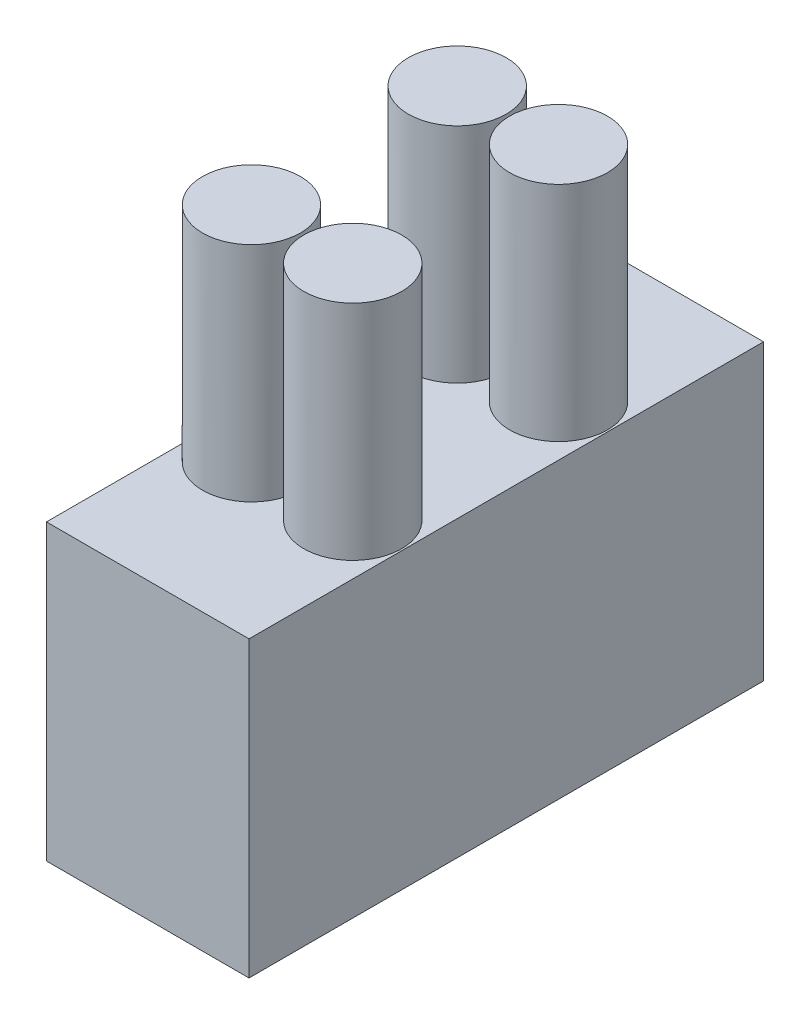
ISO-10303-21;
HEADER;
FILE_DESCRIPTION(('STEP AP214'),'2;1');
FILE_NAME('part.step','',(''),(''),'','','');
FILE_SCHEMA(('AUTOMOTIVE_DESIGN { 1 0 10303 214 1 1 1 1 }'));
ENDSEC;
DATA;
#1=APPLICATION_CONTEXT('core data for automotive mechanical design processes');
#2=APPLICATION_PROTOCOL_DEFINITION('international standard','automotive_design',2000,#1);
#3=PRODUCT_CONTEXT('',#1,'mechanical');
#4=PRODUCT('Part','Part','',(#3));
#5=PRODUCT_RELATED_PRODUCT_CATEGORY('part','',(#4));
#6=PRODUCT_DEFINITION_FORMATION('','',#4);
#7=PRODUCT_DEFINITION_CONTEXT('part definition',#1,'design');
#8=PRODUCT_DEFINITION('design','',#6,#7);
#9=PRODUCT_DEFINITION_SHAPE('','',#8);
#10=(LENGTH_UNIT() NAMED_UNIT(*) SI_UNIT(.MILLI.,.METRE.));
#11=(NAMED_UNIT(*) PLANE_ANGLE_UNIT() SI_UNIT($,.RADIAN.));
#12=(NAMED_UNIT(*) SI_UNIT($,.STERADIAN.) SOLID_ANGLE_UNIT());
#13=UNCERTAINTY_MEASURE_WITH_UNIT(LENGTH_MEASURE(1.E-05),#10,'distance_accuracy_value','');
#14=(GEOMETRIC_REPRESENTATION_CONTEXT(3) GLOBAL_UNCERTAINTY_ASSIGNED_CONTEXT((#13)) GLOBAL_UNIT_ASSIGNED_CONTEXT((#10,
#11,#12)) REPRESENTATION_CONTEXT('',''));
#15=CARTESIAN_POINT('',(0.,0.,0.));
#16=DIRECTION('',(0.,0.,1.));
#17=DIRECTION('',(1.,0.,0.));
#18=AXIS2_PLACEMENT_3D('',#15,#16,#17);
#19=CARTESIAN_POINT('',(0.,8.7,0.));
#20=DIRECTION('',(1.,0.,0.));
#21=DIRECTION('',(0.,0.,-1.));
#22=AXIS2_PLACEMENT_3D('',#19,#20,#21);
#23=PLANE('',#22);
#24=DIRECTION('',(0.,0.,1.));
#25=VECTOR('',#24,1.);
#26=CARTESIAN_POINT('',(0.,0.,0.));
#27=LINE('',#26,#25);
#28=CARTESIAN_POINT('',(0.,0.,-15.24));
#29=VERTEX_POINT('',#28);
#30=CARTESIAN_POINT('',(0.,0.,0.));
#31=VERTEX_POINT('',#30);
#32=EDGE_CURVE('E115',#29,#31,#27,.T.);
#33=ORIENTED_EDGE('',*,*,#32,.T.);
#34=DIRECTION('',(0.,-1.,0.));
#35=VECTOR('',#34,1.);
#36=CARTESIAN_POINT('',(0.,8.7,0.));
#37=LINE('',#36,#35);
#38=CARTESIAN_POINT('',(0.,8.7,0.));
#39=VERTEX_POINT('',#38);
#40=EDGE_CURVE('E104',#39,#31,#37,.T.);
#41=ORIENTED_EDGE('',*,*,#40,.F.);
#42=DIRECTION('',(0.,0.,1.));
#43=VECTOR('',#42,1.);
#44=CARTESIAN_POINT('',(0.,8.7,0.));
#45=LINE('',#44,#43);
#46=CARTESIAN_POINT('',(0.,8.7,-15.24));
#47=VERTEX_POINT('',#46);
#48=EDGE_CURVE('E96',#47,#39,#45,.T.);
#49=ORIENTED_EDGE('',*,*,#48,.F.);
#50=DIRECTION('',(0.,-1.,0.));
#51=VECTOR('',#50,1.);
#52=CARTESIAN_POINT('',(0.,8.7,-15.24));
#53=LINE('',#52,#51);
#54=EDGE_CURVE('E111',#47,#29,#53,.T.);
#55=ORIENTED_EDGE('',*,*,#54,.T.);
#56=EDGE_LOOP('',(#33,#41,#49,#55));
#57=FACE_BOUND('',#56,.T.);
#58=ADVANCED_FACE('F43',(#57),#23,.F.);
#59=CARTESIAN_POINT('',(0.,8.7,0.));
#60=DIRECTION('',(0.,0.,-1.));
#61=DIRECTION('',(-1.,0.,0.));
#62=AXIS2_PLACEMENT_3D('',#59,#60,#61);
#63=PLANE('',#62);
#64=DIRECTION('',(1.,0.,0.));
#65=VECTOR('',#64,1.);
#66=CARTESIAN_POINT('',(0.,0.,0.));
#67=LINE('',#66,#65);
#68=CARTESIAN_POINT('',(6.,0.,0.));
#69=VERTEX_POINT('',#68);
#70=EDGE_CURVE('E102',#31,#69,#67,.T.);
#71=ORIENTED_EDGE('',*,*,#70,.T.);
#72=DIRECTION('',(0.,-1.,0.));
#73=VECTOR('',#72,1.);
#74=CARTESIAN_POINT('',(6.,8.7,0.));
#75=LINE('',#74,#73);
#76=CARTESIAN_POINT('',(6.,8.7,0.));
#77=VERTEX_POINT('',#76);
#78=EDGE_CURVE('E100',#77,#69,#75,.T.);
#79=ORIENTED_EDGE('',*,*,#78,.F.);
#80=DIRECTION('',(1.,0.,0.));
#81=VECTOR('',#80,1.);
#82=CARTESIAN_POINT('',(0.,8.7,0.));
#83=LINE('',#82,#81);
#84=EDGE_CURVE('E91',#39,#77,#83,.T.);
#85=ORIENTED_EDGE('',*,*,#84,.F.);
#86=ORIENTED_EDGE('',*,*,#40,.T.);
#87=EDGE_LOOP('',(#71,#79,#85,#86));
#88=FACE_BOUND('',#87,.T.);
#89=ADVANCED_FACE('F101',(#88),#63,.F.);
#90=CARTESIAN_POINT('',(6.,8.7,0.));
#91=DIRECTION('',(-1.,0.,0.));
#92=DIRECTION('',(0.,0.,1.));
#93=AXIS2_PLACEMENT_3D('',#90,#91,#92);
#94=PLANE('',#93);
#95=DIRECTION('',(0.,0.,-1.));
#96=VECTOR('',#95,1.);
#97=CARTESIAN_POINT('',(6.,0.,0.));
#98=LINE('',#97,#96);
#99=CARTESIAN_POINT('',(6.,0.,-15.24));
#100=VERTEX_POINT('',#99);
#101=EDGE_CURVE('E77',#69,#100,#98,.T.);
#102=ORIENTED_EDGE('',*,*,#101,.T.);
#103=DIRECTION('',(0.,-1.,0.));
#104=VECTOR('',#103,1.);
#105=CARTESIAN_POINT('',(6.,8.7,-15.24));
#106=LINE('',#105,#104);
#107=CARTESIAN_POINT('',(6.,8.7,-15.24));
#108=VERTEX_POINT('',#107);
#109=EDGE_CURVE('E105',#108,#100,#106,.T.);
#110=ORIENTED_EDGE('',*,*,#109,.F.);
#111=DIRECTION('',(0.,0.,-1.));
#112=VECTOR('',#111,1.);
#113=CARTESIAN_POINT('',(6.,8.7,0.));
#114=LINE('',#113,#112);
#115=EDGE_CURVE('E94',#77,#108,#114,.T.);
#116=ORIENTED_EDGE('',*,*,#115,.F.);
#117=ORIENTED_EDGE('',*,*,#78,.T.);
#118=EDGE_LOOP('',(#102,#110,#116,#117));
#119=FACE_BOUND('',#118,.T.);
#120=ADVANCED_FACE('F107',(#119),#94,.F.);
#121=CARTESIAN_POINT('',(0.,8.7,-15.24));
#122=DIRECTION('',(0.,0.,1.));
#123=DIRECTION('',(1.,0.,0.));
#124=AXIS2_PLACEMENT_3D('',#121,#122,#123);
#125=PLANE('',#124);
#126=DIRECTION('',(-1.,0.,0.));
#127=VECTOR('',#126,1.);
#128=CARTESIAN_POINT('',(0.,0.,-15.24));
#129=LINE('',#128,#127);
#130=EDGE_CURVE('E83',#100,#29,#129,.T.);
#131=ORIENTED_EDGE('',*,*,#130,.T.);
#132=ORIENTED_EDGE('',*,*,#54,.F.);
#133=DIRECTION('',(-1.,0.,0.));
#134=VECTOR('',#133,1.);
#135=CARTESIAN_POINT('',(0.,8.7,-15.24));
#136=LINE('',#135,#134);
#137=EDGE_CURVE('E60',#108,#47,#136,.T.);
#138=ORIENTED_EDGE('',*,*,#137,.F.);
#139=ORIENTED_EDGE('',*,*,#109,.T.);
#140=EDGE_LOOP('',(#131,#132,#138,#139));
#141=FACE_BOUND('',#140,.T.);
#142=ADVANCED_FACE('F148',(#141),#125,.F.);
#143=CARTESIAN_POINT('',(0.,8.7,0.));
#144=DIRECTION('',(0.,-1.,0.));
#145=DIRECTION('',(0.,0.,-1.));
#146=AXIS2_PLACEMENT_3D('',#143,#144,#145);
#147=PLANE('',#146);
#148=CARTESIAN_POINT('',(4.5,8.7,-10.668));
#149=DIRECTION('',(0.,-1.,0.));
#150=DIRECTION('',(0.,0.,-1.));
#151=AXIS2_PLACEMENT_3D('',#148,#149,#150);
#152=CIRCLE('',#151,1.45);
#153=CARTESIAN_POINT('',(4.5,8.7,-12.118));
#154=VERTEX_POINT('',#153);
#155=EDGE_CURVE('E11',#154,#154,#152,.F.);
#156=ORIENTED_EDGE('',*,*,#155,.F.);
#157=EDGE_LOOP('',(#156));
#158=FACE_BOUND('',#157,.T.);
#159=CARTESIAN_POINT('',(4.5,8.7,-4.572));
#160=DIRECTION('',(0.,-1.,0.));
#161=DIRECTION('',(0.,0.,-1.));
#162=AXIS2_PLACEMENT_3D('',#159,#160,#161);
#163=CIRCLE('',#162,1.45);
#164=CARTESIAN_POINT('',(4.5,8.7,-6.022));
#165=VERTEX_POINT('',#164);
#166=EDGE_CURVE('E52',#165,#165,#163,.F.);
#167=ORIENTED_EDGE('',*,*,#166,.F.);
#168=EDGE_LOOP('',(#167));
#169=FACE_BOUND('',#168,.T.);
#170=CARTESIAN_POINT('',(1.5,8.7,-4.572));
#171=DIRECTION('',(0.,-1.,0.));
#172=DIRECTION('',(0.,0.,-1.));
#173=AXIS2_PLACEMENT_3D('',#170,#171,#172);
#174=CIRCLE('',#173,1.45);
#175=CARTESIAN_POINT('',(1.5,8.7,-6.022));
#176=VERTEX_POINT('',#175);
#177=EDGE_CURVE('E136',#176,#176,#174,.F.);
#178=ORIENTED_EDGE('',*,*,#177,.F.);
#179=EDGE_LOOP('',(#178));
#180=FACE_BOUND('',#179,.T.);
#181=CARTESIAN_POINT('',(1.5,8.7,-10.668));
#182=DIRECTION('',(0.,-1.,0.));
#183=DIRECTION('',(0.,0.,-1.));
#184=AXIS2_PLACEMENT_3D('',#181,#182,#183);
#185=CIRCLE('',#184,1.45);
#186=CARTESIAN_POINT('',(1.5,8.7,-12.118));
#187=VERTEX_POINT('',#186);
#188=EDGE_CURVE('E132',#187,#187,#185,.F.);
#189=ORIENTED_EDGE('',*,*,#188,.F.);
#190=EDGE_LOOP('',(#189));
#191=FACE_BOUND('',#190,.T.);
#192=ORIENTED_EDGE('',*,*,#48,.T.);
#193=ORIENTED_EDGE('',*,*,#84,.T.);
#194=ORIENTED_EDGE('',*,*,#115,.T.);
#195=ORIENTED_EDGE('',*,*,#137,.T.);
#196=EDGE_LOOP('',(#192,#193,#194,#195));
#197=FACE_BOUND('',#196,.T.);
#198=ADVANCED_FACE('F92',(#158,#169,#180,#191,#197),#147,.F.);
#199=CARTESIAN_POINT('',(0.,0.,0.));
#200=DIRECTION('',(0.,-1.,0.));
#201=DIRECTION('',(0.,0.,-1.));
#202=AXIS2_PLACEMENT_3D('',#199,#200,#201);
#203=PLANE('',#202);
#204=ORIENTED_EDGE('',*,*,#32,.F.);
#205=ORIENTED_EDGE('',*,*,#130,.F.);
#206=ORIENTED_EDGE('',*,*,#101,.F.);
#207=ORIENTED_EDGE('',*,*,#70,.F.);
#208=EDGE_LOOP('',(#204,#205,#206,#207));
#209=FACE_BOUND('',#208,.T.);
#210=ADVANCED_FACE('F147',(#209),#203,.T.);
#211=CARTESIAN_POINT('',(1.5,15.3,-10.668));
#212=DIRECTION('',(0.,-1.,0.));
#213=DIRECTION('',(0.,0.,-1.));
#214=AXIS2_PLACEMENT_3D('',#211,#212,#213);
#215=CYLINDRICAL_SURFACE('',#214,1.45);
#216=CARTESIAN_POINT('',(1.5,15.3,-10.668));
#217=DIRECTION('',(0.,1.,0.));
#218=DIRECTION('',(0.,0.,1.));
#219=AXIS2_PLACEMENT_3D('',#216,#217,#218);
#220=CIRCLE('',#219,1.45);
#221=CARTESIAN_POINT('',(1.5,15.3,-9.218));
#222=VERTEX_POINT('',#221);
#223=EDGE_CURVE('E119',#222,#222,#220,.T.);
#224=ORIENTED_EDGE('',*,*,#223,.F.);
#225=EDGE_LOOP('',(#224));
#226=FACE_BOUND('',#225,.T.);
#227=ORIENTED_EDGE('',*,*,#188,.T.);
#228=EDGE_LOOP('',(#227));
#229=FACE_BOUND('',#228,.T.);
#230=ADVANCED_FACE('F155',(#226,#229),#215,.T.);
#231=CARTESIAN_POINT('',(1.5,15.3,-10.668));
#232=DIRECTION('',(0.,1.,0.));
#233=DIRECTION('',(0.,0.,1.));
#234=AXIS2_PLACEMENT_3D('',#231,#232,#233);
#235=PLANE('',#234);
#236=ORIENTED_EDGE('',*,*,#223,.T.);
#237=EDGE_LOOP('',(#236));
#238=FACE_BOUND('',#237,.T.);
#239=ADVANCED_FACE('F157',(#238),#235,.T.);
#240=CARTESIAN_POINT('',(1.5,15.3,-4.572));
#241=DIRECTION('',(0.,-1.,0.));
#242=DIRECTION('',(0.,0.,-1.));
#243=AXIS2_PLACEMENT_3D('',#240,#241,#242);
#244=CYLINDRICAL_SURFACE('',#243,1.45);
#245=CARTESIAN_POINT('',(1.5,15.3,-4.572));
#246=DIRECTION('',(0.,1.,0.));
#247=DIRECTION('',(0.,0.,1.));
#248=AXIS2_PLACEMENT_3D('',#245,#246,#247);
#249=CIRCLE('',#248,1.45);
#250=CARTESIAN_POINT('',(1.5,15.3,-3.122));
#251=VERTEX_POINT('',#250);
#252=EDGE_CURVE('E318',#251,#251,#249,.T.);
#253=ORIENTED_EDGE('',*,*,#252,.F.);
#254=EDGE_LOOP('',(#253));
#255=FACE_BOUND('',#254,.T.);
#256=ORIENTED_EDGE('',*,*,#177,.T.);
#257=EDGE_LOOP('',(#256));
#258=FACE_BOUND('',#257,.T.);
#259=ADVANCED_FACE('F164',(#255,#258),#244,.T.);
#260=CARTESIAN_POINT('',(1.5,15.3,-4.572));
#261=DIRECTION('',(0.,1.,0.));
#262=DIRECTION('',(0.,0.,1.));
#263=AXIS2_PLACEMENT_3D('',#260,#261,#262);
#264=PLANE('',#263);
#265=ORIENTED_EDGE('',*,*,#252,.T.);
#266=EDGE_LOOP('',(#265));
#267=FACE_BOUND('',#266,.T.);
#268=ADVANCED_FACE('F237',(#267),#264,.T.);
#269=CARTESIAN_POINT('',(4.5,15.3,-4.572));
#270=DIRECTION('',(0.,-1.,0.));
#271=DIRECTION('',(0.,0.,-1.));
#272=AXIS2_PLACEMENT_3D('',#269,#270,#271);
#273=CYLINDRICAL_SURFACE('',#272,1.45);
#274=CARTESIAN_POINT('',(4.5,15.3,-4.572));
#275=DIRECTION('',(0.,1.,0.));
#276=DIRECTION('',(0.,0.,1.));
#277=AXIS2_PLACEMENT_3D('',#274,#275,#276);
#278=CIRCLE('',#277,1.45);
#279=CARTESIAN_POINT('',(4.5,15.3,-3.122));
#280=VERTEX_POINT('',#279);
#281=EDGE_CURVE('E314',#280,#280,#278,.T.);
#282=ORIENTED_EDGE('',*,*,#281,.F.);
#283=EDGE_LOOP('',(#282));
#284=FACE_BOUND('',#283,.T.);
#285=ORIENTED_EDGE('',*,*,#166,.T.);
#286=EDGE_LOOP('',(#285));
#287=FACE_BOUND('',#286,.T.);
#288=ADVANCED_FACE('F143',(#284,#287),#273,.T.);
#289=CARTESIAN_POINT('',(4.5,15.3,-4.572));
#290=DIRECTION('',(0.,1.,0.));
#291=DIRECTION('',(0.,0.,1.));
#292=AXIS2_PLACEMENT_3D('',#289,#290,#291);
#293=PLANE('',#292);
#294=ORIENTED_EDGE('',*,*,#281,.T.);
#295=EDGE_LOOP('',(#294));
#296=FACE_BOUND('',#295,.T.);
#297=ADVANCED_FACE('F256',(#296),#293,.T.);
#298=CARTESIAN_POINT('',(4.5,15.3,-10.668));
#299=DIRECTION('',(0.,-1.,0.));
#300=DIRECTION('',(0.,0.,-1.));
#301=AXIS2_PLACEMENT_3D('',#298,#299,#300);
#302=CYLINDRICAL_SURFACE('',#301,1.45);
#303=CARTESIAN_POINT('',(4.5,15.3,-10.668));
#304=DIRECTION('',(0.,1.,0.));
#305=DIRECTION('',(0.,0.,1.));
#306=AXIS2_PLACEMENT_3D('',#303,#304,#305);
#307=CIRCLE('',#306,1.45);
#308=CARTESIAN_POINT('',(4.5,15.3,-9.218));
#309=VERTEX_POINT('',#308);
#310=EDGE_CURVE('E312',#309,#309,#307,.T.);
#311=ORIENTED_EDGE('',*,*,#310,.F.);
#312=EDGE_LOOP('',(#311));
#313=FACE_BOUND('',#312,.T.);
#314=ORIENTED_EDGE('',*,*,#155,.T.);
#315=EDGE_LOOP('',(#314));
#316=FACE_BOUND('',#315,.T.);
#317=ADVANCED_FACE('F266',(#313,#316),#302,.T.);
#318=CARTESIAN_POINT('',(4.5,15.3,-10.668));
#319=DIRECTION('',(0.,1.,0.));
#320=DIRECTION('',(0.,0.,1.));
#321=AXIS2_PLACEMENT_3D('',#318,#319,#320);
#322=PLANE('',#321);
#323=ORIENTED_EDGE('',*,*,#310,.T.);
#324=EDGE_LOOP('',(#323));
#325=FACE_BOUND('',#324,.T.);
#326=ADVANCED_FACE('F276',(#325),#322,.T.);
#327=CLOSED_SHELL('',(#58,#89,#120,#142,#198,#210,#230,#239,#259,#268,#288,#297,#317,#326));
#328=MANIFOLD_SOLID_BREP('B2',#327);
#329=ADVANCED_BREP_SHAPE_REPRESENTATION('',(#18,#328),#14);
#330=SHAPE_DEFINITION_REPRESENTATION(#9,#329);
ENDSEC;
END-ISO-10303-21;
